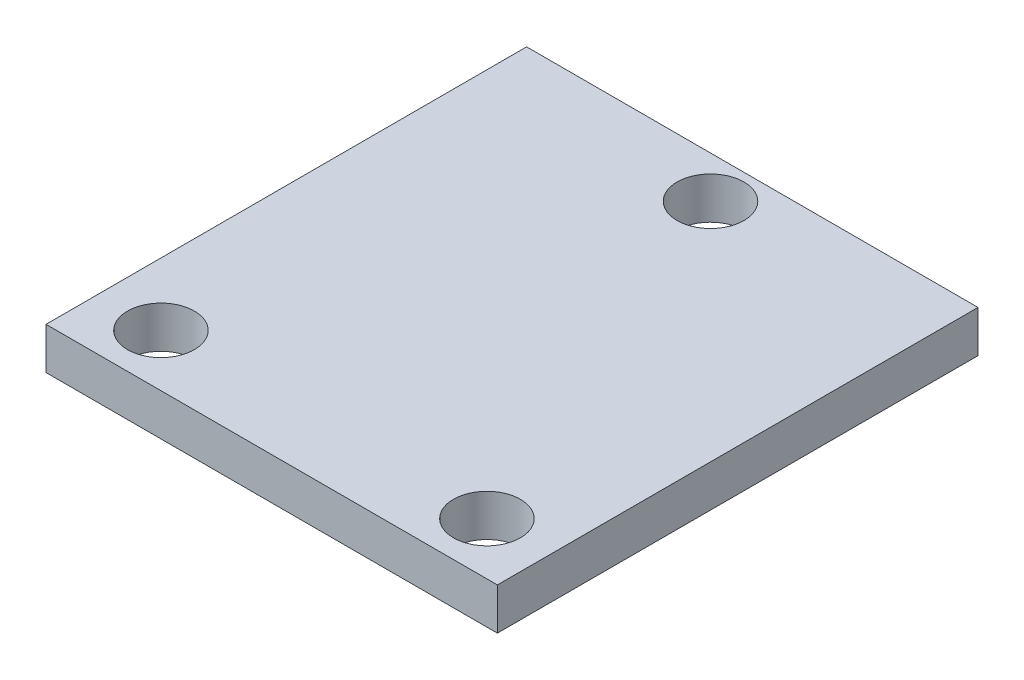
ISO-10303-21;
HEADER;
FILE_DESCRIPTION(('STEP AP214'),'2;1');
FILE_NAME('part.step','',(''),(''),'','','');
FILE_SCHEMA(('AUTOMOTIVE_DESIGN { 1 0 10303 214 1 1 1 1 }'));
ENDSEC;
DATA;
#1=APPLICATION_CONTEXT('core data for automotive mechanical design processes');
#2=APPLICATION_PROTOCOL_DEFINITION('international standard','automotive_design',2000,#1);
#3=PRODUCT_CONTEXT('',#1,'mechanical');
#4=PRODUCT('Part','Part','',(#3));
#5=PRODUCT_RELATED_PRODUCT_CATEGORY('part','',(#4));
#6=PRODUCT_DEFINITION_FORMATION('','',#4);
#7=PRODUCT_DEFINITION_CONTEXT('part definition',#1,'design');
#8=PRODUCT_DEFINITION('design','',#6,#7);
#9=PRODUCT_DEFINITION_SHAPE('','',#8);
#10=(LENGTH_UNIT() NAMED_UNIT(*) SI_UNIT(.MILLI.,.METRE.));
#11=(NAMED_UNIT(*) PLANE_ANGLE_UNIT() SI_UNIT($,.RADIAN.));
#12=(NAMED_UNIT(*) SI_UNIT($,.STERADIAN.) SOLID_ANGLE_UNIT());
#13=UNCERTAINTY_MEASURE_WITH_UNIT(LENGTH_MEASURE(1.E-05),#10,'distance_accuracy_value','');
#14=(GEOMETRIC_REPRESENTATION_CONTEXT(3) GLOBAL_UNCERTAINTY_ASSIGNED_CONTEXT((#13)) GLOBAL_UNIT_ASSIGNED_CONTEXT((#10,
#11,#12)) REPRESENTATION_CONTEXT('',''));
#15=CARTESIAN_POINT('',(0.,0.,0.));
#16=DIRECTION('',(0.,0.,1.));
#17=DIRECTION('',(1.,0.,0.));
#18=AXIS2_PLACEMENT_3D('',#15,#16,#17);
#19=CARTESIAN_POINT('',(0.,1.,0.));
#20=DIRECTION('',(0.,1.,0.));
#21=DIRECTION('',(0.,0.,1.));
#22=AXIS2_PLACEMENT_3D('',#19,#20,#21);
#23=PLANE('',#22);
#24=CARTESIAN_POINT('',(9.3,1.,10.25));
#25=DIRECTION('',(0.,1.,0.));
#26=DIRECTION('',(0.,0.,1.));
#27=AXIS2_PLACEMENT_3D('',#24,#25,#26);
#28=CIRCLE('',#27,0.800000000000002);
#29=CARTESIAN_POINT('',(9.3,1.,11.05));
#30=VERTEX_POINT('',#29);
#31=EDGE_CURVE('E119',#30,#30,#28,.T.);
#32=ORIENTED_EDGE('',*,*,#31,.F.);
#33=EDGE_LOOP('',(#32));
#34=FACE_BOUND('',#33,.T.);
#35=DIRECTION('',(0.,0.,1.));
#36=VECTOR('',#35,1.);
#37=CARTESIAN_POINT('',(0.,1.,0.));
#38=LINE('',#37,#36);
#39=CARTESIAN_POINT('',(0.,1.,0.));
#40=VERTEX_POINT('',#39);
#41=CARTESIAN_POINT('',(0.,1.,11.5));
#42=VERTEX_POINT('',#41);
#43=EDGE_CURVE('E89',#40,#42,#38,.T.);
#44=ORIENTED_EDGE('',*,*,#43,.T.);
#45=DIRECTION('',(1.,0.,0.));
#46=VECTOR('',#45,1.);
#47=CARTESIAN_POINT('',(0.,1.,11.5));
#48=LINE('',#47,#46);
#49=CARTESIAN_POINT('',(10.8,1.,11.5));
#50=VERTEX_POINT('',#49);
#51=EDGE_CURVE('E84',#42,#50,#48,.T.);
#52=ORIENTED_EDGE('',*,*,#51,.T.);
#53=DIRECTION('',(0.,0.,-1.));
#54=VECTOR('',#53,1.);
#55=CARTESIAN_POINT('',(10.8,1.,0.));
#56=LINE('',#55,#54);
#57=CARTESIAN_POINT('',(10.8,1.,0.));
#58=VERTEX_POINT('',#57);
#59=EDGE_CURVE('E87',#50,#58,#56,.T.);
#60=ORIENTED_EDGE('',*,*,#59,.T.);
#61=DIRECTION('',(-1.,0.,0.));
#62=VECTOR('',#61,1.);
#63=CARTESIAN_POINT('',(0.,1.,0.));
#64=LINE('',#63,#62);
#65=EDGE_CURVE('E54',#58,#40,#64,.T.);
#66=ORIENTED_EDGE('',*,*,#65,.T.);
#67=EDGE_LOOP('',(#44,#52,#60,#66));
#68=FACE_BOUND('',#67,.T.);
#69=CARTESIAN_POINT('',(5.4,1.,1.));
#70=DIRECTION('',(0.,1.,0.));
#71=DIRECTION('',(0.,0.,1.));
#72=AXIS2_PLACEMENT_3D('',#69,#70,#71);
#73=CIRCLE('',#72,0.800000000000002);
#74=CARTESIAN_POINT('',(5.4,1.,1.8));
#75=VERTEX_POINT('',#74);
#76=EDGE_CURVE('E104',#75,#75,#73,.T.);
#77=ORIENTED_EDGE('',*,*,#76,.F.);
#78=EDGE_LOOP('',(#77));
#79=FACE_BOUND('',#78,.T.);
#80=CARTESIAN_POINT('',(1.5,1.,10.25));
#81=DIRECTION('',(0.,1.,0.));
#82=DIRECTION('',(0.,0.,1.));
#83=AXIS2_PLACEMENT_3D('',#80,#81,#82);
#84=CIRCLE('',#83,0.800000000000001);
#85=CARTESIAN_POINT('',(1.5,1.,11.05));
#86=VERTEX_POINT('',#85);
#87=EDGE_CURVE('E125',#86,#86,#84,.T.);
#88=ORIENTED_EDGE('',*,*,#87,.F.);
#89=EDGE_LOOP('',(#88));
#90=FACE_BOUND('',#89,.T.);
#91=ADVANCED_FACE('F37',(#34,#68,#79,#90),#23,.T.);
#92=CARTESIAN_POINT('',(0.,0.,0.));
#93=DIRECTION('',(0.,1.,0.));
#94=DIRECTION('',(0.,0.,1.));
#95=AXIS2_PLACEMENT_3D('',#92,#93,#94);
#96=PLANE('',#95);
#97=DIRECTION('',(0.,0.,1.));
#98=VECTOR('',#97,1.);
#99=CARTESIAN_POINT('',(0.,0.,0.));
#100=LINE('',#99,#98);
#101=CARTESIAN_POINT('',(0.,0.,0.));
#102=VERTEX_POINT('',#101);
#103=CARTESIAN_POINT('',(0.,0.,11.5));
#104=VERTEX_POINT('',#103);
#105=EDGE_CURVE('E101',#102,#104,#100,.T.);
#106=ORIENTED_EDGE('',*,*,#105,.F.);
#107=DIRECTION('',(-1.,0.,0.));
#108=VECTOR('',#107,1.);
#109=CARTESIAN_POINT('',(0.,0.,0.));
#110=LINE('',#109,#108);
#111=CARTESIAN_POINT('',(10.8,0.,0.));
#112=VERTEX_POINT('',#111);
#113=EDGE_CURVE('E77',#112,#102,#110,.T.);
#114=ORIENTED_EDGE('',*,*,#113,.F.);
#115=DIRECTION('',(0.,0.,-1.));
#116=VECTOR('',#115,1.);
#117=CARTESIAN_POINT('',(10.8,0.,0.));
#118=LINE('',#117,#116);
#119=CARTESIAN_POINT('',(10.8,0.,11.5));
#120=VERTEX_POINT('',#119);
#121=EDGE_CURVE('E71',#120,#112,#118,.T.);
#122=ORIENTED_EDGE('',*,*,#121,.F.);
#123=DIRECTION('',(1.,0.,0.));
#124=VECTOR('',#123,1.);
#125=CARTESIAN_POINT('',(0.,0.,11.5));
#126=LINE('',#125,#124);
#127=EDGE_CURVE('E93',#104,#120,#126,.T.);
#128=ORIENTED_EDGE('',*,*,#127,.F.);
#129=EDGE_LOOP('',(#106,#114,#122,#128));
#130=FACE_BOUND('',#129,.T.);
#131=CARTESIAN_POINT('',(5.4,0.,1.));
#132=DIRECTION('',(0.,1.,0.));
#133=DIRECTION('',(0.,0.,1.));
#134=AXIS2_PLACEMENT_3D('',#131,#132,#133);
#135=CIRCLE('',#134,0.800000000000002);
#136=CARTESIAN_POINT('',(5.4,0.,1.8));
#137=VERTEX_POINT('',#136);
#138=EDGE_CURVE('E116',#137,#137,#135,.T.);
#139=ORIENTED_EDGE('',*,*,#138,.T.);
#140=EDGE_LOOP('',(#139));
#141=FACE_BOUND('',#140,.T.);
#142=CARTESIAN_POINT('',(9.3,0.,10.25));
#143=DIRECTION('',(0.,1.,0.));
#144=DIRECTION('',(0.,0.,1.));
#145=AXIS2_PLACEMENT_3D('',#142,#143,#144);
#146=CIRCLE('',#145,0.800000000000002);
#147=CARTESIAN_POINT('',(9.3,0.,11.05));
#148=VERTEX_POINT('',#147);
#149=EDGE_CURVE('E122',#148,#148,#146,.T.);
#150=ORIENTED_EDGE('',*,*,#149,.T.);
#151=EDGE_LOOP('',(#150));
#152=FACE_BOUND('',#151,.T.);
#153=CARTESIAN_POINT('',(1.5,0.,10.25));
#154=DIRECTION('',(0.,1.,0.));
#155=DIRECTION('',(0.,0.,1.));
#156=AXIS2_PLACEMENT_3D('',#153,#154,#155);
#157=CIRCLE('',#156,0.800000000000001);
#158=CARTESIAN_POINT('',(1.5,0.,11.05));
#159=VERTEX_POINT('',#158);
#160=EDGE_CURVE('E128',#159,#159,#157,.T.);
#161=ORIENTED_EDGE('',*,*,#160,.T.);
#162=EDGE_LOOP('',(#161));
#163=FACE_BOUND('',#162,.T.);
#164=ADVANCED_FACE('F112',(#130,#141,#152,#163),#96,.F.);
#165=CARTESIAN_POINT('',(0.,1.,0.));
#166=DIRECTION('',(1.,0.,0.));
#167=DIRECTION('',(0.,0.,-1.));
#168=AXIS2_PLACEMENT_3D('',#165,#166,#167);
#169=PLANE('',#168);
#170=ORIENTED_EDGE('',*,*,#105,.T.);
#171=DIRECTION('',(0.,-1.,0.));
#172=VECTOR('',#171,1.);
#173=CARTESIAN_POINT('',(0.,1.,11.5));
#174=LINE('',#173,#172);
#175=EDGE_CURVE('E11',#42,#104,#174,.T.);
#176=ORIENTED_EDGE('',*,*,#175,.F.);
#177=ORIENTED_EDGE('',*,*,#43,.F.);
#178=DIRECTION('',(0.,-1.,0.));
#179=VECTOR('',#178,1.);
#180=CARTESIAN_POINT('',(0.,1.,0.));
#181=LINE('',#180,#179);
#182=EDGE_CURVE('E97',#40,#102,#181,.T.);
#183=ORIENTED_EDGE('',*,*,#182,.T.);
#184=EDGE_LOOP('',(#170,#176,#177,#183));
#185=FACE_BOUND('',#184,.T.);
#186=ADVANCED_FACE('F39',(#185),#169,.F.);
#187=CARTESIAN_POINT('',(0.,1.,11.5));
#188=DIRECTION('',(0.,0.,-1.));
#189=DIRECTION('',(-1.,0.,0.));
#190=AXIS2_PLACEMENT_3D('',#187,#188,#189);
#191=PLANE('',#190);
#192=ORIENTED_EDGE('',*,*,#127,.T.);
#193=DIRECTION('',(0.,-1.,0.));
#194=VECTOR('',#193,1.);
#195=CARTESIAN_POINT('',(10.8,1.,11.5));
#196=LINE('',#195,#194);
#197=EDGE_CURVE('E46',#50,#120,#196,.T.);
#198=ORIENTED_EDGE('',*,*,#197,.F.);
#199=ORIENTED_EDGE('',*,*,#51,.F.);
#200=ORIENTED_EDGE('',*,*,#175,.T.);
#201=EDGE_LOOP('',(#192,#198,#199,#200));
#202=FACE_BOUND('',#201,.T.);
#203=ADVANCED_FACE('F92',(#202),#191,.F.);
#204=CARTESIAN_POINT('',(10.8,1.,0.));
#205=DIRECTION('',(-1.,0.,0.));
#206=DIRECTION('',(0.,0.,1.));
#207=AXIS2_PLACEMENT_3D('',#204,#205,#206);
#208=PLANE('',#207);
#209=ORIENTED_EDGE('',*,*,#121,.T.);
#210=DIRECTION('',(0.,-1.,0.));
#211=VECTOR('',#210,1.);
#212=CARTESIAN_POINT('',(10.8,1.,0.));
#213=LINE('',#212,#211);
#214=EDGE_CURVE('E94',#58,#112,#213,.T.);
#215=ORIENTED_EDGE('',*,*,#214,.F.);
#216=ORIENTED_EDGE('',*,*,#59,.F.);
#217=ORIENTED_EDGE('',*,*,#197,.T.);
#218=EDGE_LOOP('',(#209,#215,#216,#217));
#219=FACE_BOUND('',#218,.T.);
#220=ADVANCED_FACE('F95',(#219),#208,.F.);
#221=CARTESIAN_POINT('',(0.,1.,0.));
#222=DIRECTION('',(0.,0.,1.));
#223=DIRECTION('',(1.,0.,0.));
#224=AXIS2_PLACEMENT_3D('',#221,#222,#223);
#225=PLANE('',#224);
#226=ORIENTED_EDGE('',*,*,#113,.T.);
#227=ORIENTED_EDGE('',*,*,#182,.F.);
#228=ORIENTED_EDGE('',*,*,#65,.F.);
#229=ORIENTED_EDGE('',*,*,#214,.T.);
#230=EDGE_LOOP('',(#226,#227,#228,#229));
#231=FACE_BOUND('',#230,.T.);
#232=ADVANCED_FACE('F109',(#231),#225,.F.);
#233=CARTESIAN_POINT('',(5.4,1.,1.));
#234=DIRECTION('',(0.,-1.,0.));
#235=DIRECTION('',(0.,0.,-1.));
#236=AXIS2_PLACEMENT_3D('',#233,#234,#235);
#237=CYLINDRICAL_SURFACE('',#236,0.800000000000002);
#238=ORIENTED_EDGE('',*,*,#76,.T.);
#239=EDGE_LOOP('',(#238));
#240=FACE_BOUND('',#239,.T.);
#241=ORIENTED_EDGE('',*,*,#138,.F.);
#242=EDGE_LOOP('',(#241));
#243=FACE_BOUND('',#242,.T.);
#244=ADVANCED_FACE('F146',(#240,#243),#237,.F.);
#245=CARTESIAN_POINT('',(9.3,1.,10.25));
#246=DIRECTION('',(0.,-1.,0.));
#247=DIRECTION('',(0.,0.,-1.));
#248=AXIS2_PLACEMENT_3D('',#245,#246,#247);
#249=CYLINDRICAL_SURFACE('',#248,0.800000000000002);
#250=ORIENTED_EDGE('',*,*,#31,.T.);
#251=EDGE_LOOP('',(#250));
#252=FACE_BOUND('',#251,.T.);
#253=ORIENTED_EDGE('',*,*,#149,.F.);
#254=EDGE_LOOP('',(#253));
#255=FACE_BOUND('',#254,.T.);
#256=ADVANCED_FACE('F192',(#252,#255),#249,.F.);
#257=CARTESIAN_POINT('',(1.5,1.,10.25));
#258=DIRECTION('',(0.,-1.,0.));
#259=DIRECTION('',(0.,0.,-1.));
#260=AXIS2_PLACEMENT_3D('',#257,#258,#259);
#261=CYLINDRICAL_SURFACE('',#260,0.800000000000001);
#262=ORIENTED_EDGE('',*,*,#87,.T.);
#263=EDGE_LOOP('',(#262));
#264=FACE_BOUND('',#263,.T.);
#265=ORIENTED_EDGE('',*,*,#160,.F.);
#266=EDGE_LOOP('',(#265));
#267=FACE_BOUND('',#266,.T.);
#268=ADVANCED_FACE('F134',(#264,#267),#261,.F.);
#269=CLOSED_SHELL('',(#91,#164,#186,#203,#220,#232,#244,#256,#268));
#270=MANIFOLD_SOLID_BREP('B2',#269);
#271=ADVANCED_BREP_SHAPE_REPRESENTATION('',(#18,#270),#14);
#272=SHAPE_DEFINITION_REPRESENTATION(#9,#271);
ENDSEC;
END-ISO-10303-21;
